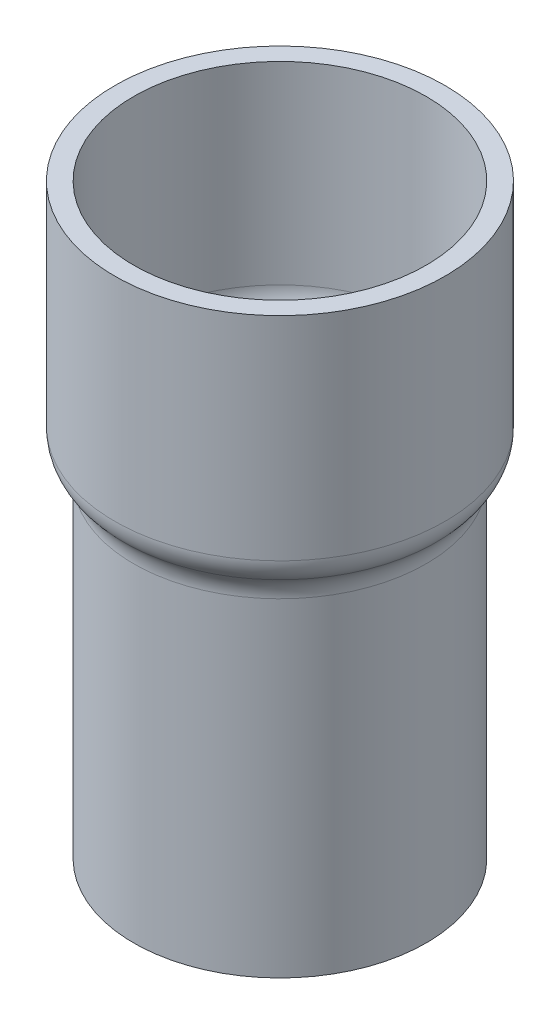
ISO-10303-21;
HEADER;
FILE_DESCRIPTION(('STEP AP214'),'2;1');
FILE_NAME('part.step','',(''),(''),'','','');
FILE_SCHEMA(('AUTOMOTIVE_DESIGN { 1 0 10303 214 1 1 1 1 }'));
ENDSEC;
DATA;
#1=APPLICATION_CONTEXT('core data for automotive mechanical design processes');
#2=APPLICATION_PROTOCOL_DEFINITION('international standard','automotive_design',2000,#1);
#3=PRODUCT_CONTEXT('',#1,'mechanical');
#4=PRODUCT('Part','Part','',(#3));
#5=PRODUCT_RELATED_PRODUCT_CATEGORY('part','',(#4));
#6=PRODUCT_DEFINITION_FORMATION('','',#4);
#7=PRODUCT_DEFINITION_CONTEXT('part definition',#1,'design');
#8=PRODUCT_DEFINITION('design','',#6,#7);
#9=PRODUCT_DEFINITION_SHAPE('','',#8);
#10=(LENGTH_UNIT() NAMED_UNIT(*) SI_UNIT(.MILLI.,.METRE.));
#11=(NAMED_UNIT(*) PLANE_ANGLE_UNIT() SI_UNIT($,.RADIAN.));
#12=(NAMED_UNIT(*) SI_UNIT($,.STERADIAN.) SOLID_ANGLE_UNIT());
#13=UNCERTAINTY_MEASURE_WITH_UNIT(LENGTH_MEASURE(1.E-05),#10,'distance_accuracy_value','');
#14=(GEOMETRIC_REPRESENTATION_CONTEXT(3) GLOBAL_UNCERTAINTY_ASSIGNED_CONTEXT((#13)) GLOBAL_UNIT_ASSIGNED_CONTEXT((#10,
#11,#12)) REPRESENTATION_CONTEXT('',''));
#15=CARTESIAN_POINT('',(0.,0.,0.));
#16=DIRECTION('',(0.,0.,1.));
#17=DIRECTION('',(1.,0.,0.));
#18=AXIS2_PLACEMENT_3D('',#15,#16,#17);
#19=CARTESIAN_POINT('',(-1.55,0.,0.));
#20=DIRECTION('',(0.,1.,0.));
#21=DIRECTION('',(0.,0.,1.));
#22=AXIS2_PLACEMENT_3D('',#19,#20,#21);
#23=PLANE('',#22);
#24=CARTESIAN_POINT('',(0.,0.,0.));
#25=DIRECTION('',(0.,-1.,0.));
#26=DIRECTION('',(0.,0.,-1.));
#27=AXIS2_PLACEMENT_3D('',#24,#25,#26);
#28=CIRCLE('',#27,1.35);
#29=CARTESIAN_POINT('',(0.,0.,-1.35));
#30=VERTEX_POINT('',#29);
#31=EDGE_CURVE('E64',#30,#30,#28,.T.);
#32=ORIENTED_EDGE('',*,*,#31,.F.);
#33=EDGE_LOOP('',(#32));
#34=FACE_BOUND('',#33,.T.);
#35=CARTESIAN_POINT('',(0.,0.,0.));
#36=DIRECTION('',(0.,-1.,0.));
#37=DIRECTION('',(0.,0.,-1.));
#38=AXIS2_PLACEMENT_3D('',#35,#36,#37);
#39=CIRCLE('',#38,1.55);
#40=CARTESIAN_POINT('',(0.,0.,-1.55));
#41=VERTEX_POINT('',#40);
#42=EDGE_CURVE('E10',#41,#41,#39,.T.);
#43=ORIENTED_EDGE('',*,*,#42,.T.);
#44=EDGE_LOOP('',(#43));
#45=FACE_BOUND('',#44,.T.);
#46=ADVANCED_FACE('F30',(#34,#45),#23,.F.);
#47=CARTESIAN_POINT('',(0.,0.,0.));
#48=DIRECTION('',(0.,-1.,0.));
#49=DIRECTION('',(0.,0.,-1.));
#50=AXIS2_PLACEMENT_3D('',#47,#48,#49);
#51=CYLINDRICAL_SURFACE('',#50,1.55);
#52=ORIENTED_EDGE('',*,*,#42,.F.);
#53=EDGE_LOOP('',(#52));
#54=FACE_BOUND('',#53,.T.);
#55=CARTESIAN_POINT('',(0.,3.48,0.));
#56=DIRECTION('',(0.,-1.,0.));
#57=DIRECTION('',(0.,0.,-1.));
#58=AXIS2_PLACEMENT_3D('',#55,#56,#57);
#59=CIRCLE('',#58,1.55);
#60=CARTESIAN_POINT('',(0.,3.48,-1.55));
#61=VERTEX_POINT('',#60);
#62=EDGE_CURVE('E36',#61,#61,#59,.T.);
#63=ORIENTED_EDGE('',*,*,#62,.T.);
#64=EDGE_LOOP('',(#63));
#65=FACE_BOUND('',#64,.T.);
#66=ADVANCED_FACE('F71',(#54,#65),#51,.T.);
#67=CARTESIAN_POINT('',(0.,3.48,0.));
#68=DIRECTION('',(0.,-1.,0.));
#69=DIRECTION('',(0.,0.,-1.));
#70=AXIS2_PLACEMENT_3D('',#67,#68,#69);
#71=TOROIDAL_SURFACE('',#70,1.9,0.35);
#72=ORIENTED_EDGE('',*,*,#62,.F.);
#73=EDGE_LOOP('',(#72));
#74=FACE_BOUND('',#73,.T.);
#75=CARTESIAN_POINT('',(0.,3.72513662012178,0.));
#76=DIRECTION('',(0.,-1.,0.));
#77=DIRECTION('',(0.,0.,-1.));
#78=AXIS2_PLACEMENT_3D('',#75,#76,#77);
#79=CIRCLE('',#78,1.65018399275613);
#80=CARTESIAN_POINT('',(0.,3.72513662012178,-1.65018399275613));
#81=VERTEX_POINT('',#80);
#82=EDGE_CURVE('E40',#81,#81,#79,.T.);
#83=ORIENTED_EDGE('',*,*,#82,.T.);
#84=EDGE_LOOP('',(#83));
#85=FACE_BOUND('',#84,.T.);
#86=ADVANCED_FACE('F75',(#74,#85),#71,.F.);
#87=CARTESIAN_POINT('',(0.,3.96937282968647,0.));
#88=DIRECTION('',(0.,-1.,0.));
#89=DIRECTION('',(0.,0.,-1.));
#90=AXIS2_PLACEMENT_3D('',#87,#88,#89);
#91=TOROIDAL_SURFACE('',#90,1.40128558391163,0.348714416088368);
#92=ORIENTED_EDGE('',*,*,#82,.F.);
#93=EDGE_LOOP('',(#92));
#94=FACE_BOUND('',#93,.T.);
#95=CARTESIAN_POINT('',(0.,3.96937282968647,0.));
#96=DIRECTION('',(0.,-1.,0.));
#97=DIRECTION('',(0.,0.,-1.));
#98=AXIS2_PLACEMENT_3D('',#95,#96,#97);
#99=CIRCLE('',#98,1.75);
#100=CARTESIAN_POINT('',(0.,3.96937282968647,-1.75));
#101=VERTEX_POINT('',#100);
#102=EDGE_CURVE('E44',#101,#101,#99,.T.);
#103=ORIENTED_EDGE('',*,*,#102,.T.);
#104=EDGE_LOOP('',(#103));
#105=FACE_BOUND('',#104,.T.);
#106=ADVANCED_FACE('F80',(#94,#105),#91,.T.);
#107=CARTESIAN_POINT('',(0.,0.,0.));
#108=DIRECTION('',(0.,-1.,0.));
#109=DIRECTION('',(0.,0.,-1.));
#110=AXIS2_PLACEMENT_3D('',#107,#108,#109);
#111=CYLINDRICAL_SURFACE('',#110,1.75);
#112=ORIENTED_EDGE('',*,*,#102,.F.);
#113=EDGE_LOOP('',(#112));
#114=FACE_BOUND('',#113,.T.);
#115=CARTESIAN_POINT('',(0.,6.22,0.));
#116=DIRECTION('',(0.,-1.,0.));
#117=DIRECTION('',(0.,0.,-1.));
#118=AXIS2_PLACEMENT_3D('',#115,#116,#117);
#119=CIRCLE('',#118,1.75);
#120=CARTESIAN_POINT('',(0.,6.22,-1.75));
#121=VERTEX_POINT('',#120);
#122=EDGE_CURVE('E49',#121,#121,#119,.T.);
#123=ORIENTED_EDGE('',*,*,#122,.T.);
#124=EDGE_LOOP('',(#123));
#125=FACE_BOUND('',#124,.T.);
#126=ADVANCED_FACE('F86',(#114,#125),#111,.T.);
#127=CARTESIAN_POINT('',(-1.55,6.22,0.));
#128=DIRECTION('',(0.,-1.,0.));
#129=DIRECTION('',(0.,0.,-1.));
#130=AXIS2_PLACEMENT_3D('',#127,#128,#129);
#131=PLANE('',#130);
#132=ORIENTED_EDGE('',*,*,#122,.F.);
#133=EDGE_LOOP('',(#132));
#134=FACE_BOUND('',#133,.T.);
#135=CARTESIAN_POINT('',(0.,6.22,0.));
#136=DIRECTION('',(0.,-1.,0.));
#137=DIRECTION('',(0.,0.,-1.));
#138=AXIS2_PLACEMENT_3D('',#135,#136,#137);
#139=CIRCLE('',#138,1.55);
#140=CARTESIAN_POINT('',(0.,6.22,-1.55));
#141=VERTEX_POINT('',#140);
#142=EDGE_CURVE('E52',#141,#141,#139,.T.);
#143=ORIENTED_EDGE('',*,*,#142,.T.);
#144=EDGE_LOOP('',(#143));
#145=FACE_BOUND('',#144,.T.);
#146=ADVANCED_FACE('F90',(#134,#145),#131,.F.);
#147=CARTESIAN_POINT('',(0.,0.,0.));
#148=DIRECTION('',(0.,-1.,0.));
#149=DIRECTION('',(0.,0.,-1.));
#150=AXIS2_PLACEMENT_3D('',#147,#148,#149);
#151=CYLINDRICAL_SURFACE('',#150,1.55);
#152=ORIENTED_EDGE('',*,*,#142,.F.);
#153=EDGE_LOOP('',(#152));
#154=FACE_BOUND('',#153,.T.);
#155=CARTESIAN_POINT('',(0.,4.16937282968648,0.));
#156=DIRECTION('',(0.,-1.,0.));
#157=DIRECTION('',(0.,0.,-1.));
#158=AXIS2_PLACEMENT_3D('',#155,#156,#157);
#159=CIRCLE('',#158,1.55);
#160=CARTESIAN_POINT('',(0.,4.16937282968648,-1.55));
#161=VERTEX_POINT('',#160);
#162=EDGE_CURVE('E55',#161,#161,#159,.T.);
#163=ORIENTED_EDGE('',*,*,#162,.T.);
#164=EDGE_LOOP('',(#163));
#165=FACE_BOUND('',#164,.T.);
#166=ADVANCED_FACE('F94',(#154,#165),#151,.F.);
#167=CARTESIAN_POINT('',(0.,4.16937282968648,0.));
#168=DIRECTION('',(0.,-1.,0.));
#169=DIRECTION('',(0.,0.,-1.));
#170=AXIS2_PLACEMENT_3D('',#167,#168,#169);
#171=TOROIDAL_SURFACE('',#170,1.20128558391163,0.348714416088368);
#172=ORIENTED_EDGE('',*,*,#162,.F.);
#173=EDGE_LOOP('',(#172));
#174=FACE_BOUND('',#173,.T.);
#175=CARTESIAN_POINT('',(0.,3.92513662012178,0.));
#176=DIRECTION('',(0.,-1.,0.));
#177=DIRECTION('',(0.,0.,-1.));
#178=AXIS2_PLACEMENT_3D('',#175,#176,#177);
#179=CIRCLE('',#178,1.45018399275613);
#180=CARTESIAN_POINT('',(0.,3.92513662012178,-1.45018399275613));
#181=VERTEX_POINT('',#180);
#182=EDGE_CURVE('E58',#181,#181,#179,.T.);
#183=ORIENTED_EDGE('',*,*,#182,.T.);
#184=EDGE_LOOP('',(#183));
#185=FACE_BOUND('',#184,.T.);
#186=ADVANCED_FACE('F98',(#174,#185),#171,.F.);
#187=CARTESIAN_POINT('',(0.,3.68,0.));
#188=DIRECTION('',(0.,-1.,0.));
#189=DIRECTION('',(0.,0.,-1.));
#190=AXIS2_PLACEMENT_3D('',#187,#188,#189);
#191=TOROIDAL_SURFACE('',#190,1.7,0.35);
#192=ORIENTED_EDGE('',*,*,#182,.F.);
#193=EDGE_LOOP('',(#192));
#194=FACE_BOUND('',#193,.T.);
#195=CARTESIAN_POINT('',(0.,3.68,0.));
#196=DIRECTION('',(0.,-1.,0.));
#197=DIRECTION('',(0.,0.,-1.));
#198=AXIS2_PLACEMENT_3D('',#195,#196,#197);
#199=CIRCLE('',#198,1.35);
#200=CARTESIAN_POINT('',(0.,3.68,-1.35));
#201=VERTEX_POINT('',#200);
#202=EDGE_CURVE('E61',#201,#201,#199,.T.);
#203=ORIENTED_EDGE('',*,*,#202,.T.);
#204=EDGE_LOOP('',(#203));
#205=FACE_BOUND('',#204,.T.);
#206=ADVANCED_FACE('F102',(#194,#205),#191,.T.);
#207=CARTESIAN_POINT('',(0.,0.,0.));
#208=DIRECTION('',(0.,-1.,0.));
#209=DIRECTION('',(0.,0.,-1.));
#210=AXIS2_PLACEMENT_3D('',#207,#208,#209);
#211=CYLINDRICAL_SURFACE('',#210,1.35);
#212=ORIENTED_EDGE('',*,*,#202,.F.);
#213=EDGE_LOOP('',(#212));
#214=FACE_BOUND('',#213,.T.);
#215=ORIENTED_EDGE('',*,*,#31,.T.);
#216=EDGE_LOOP('',(#215));
#217=FACE_BOUND('',#216,.T.);
#218=ADVANCED_FACE('F68',(#214,#217),#211,.F.);
#219=CLOSED_SHELL('',(#46,#66,#86,#106,#126,#146,#166,#186,#206,#218));
#220=MANIFOLD_SOLID_BREP('B2',#219);
#221=ADVANCED_BREP_SHAPE_REPRESENTATION('',(#18,#220),#14);
#222=SHAPE_DEFINITION_REPRESENTATION(#9,#221);
ENDSEC;
END-ISO-10303-21;
